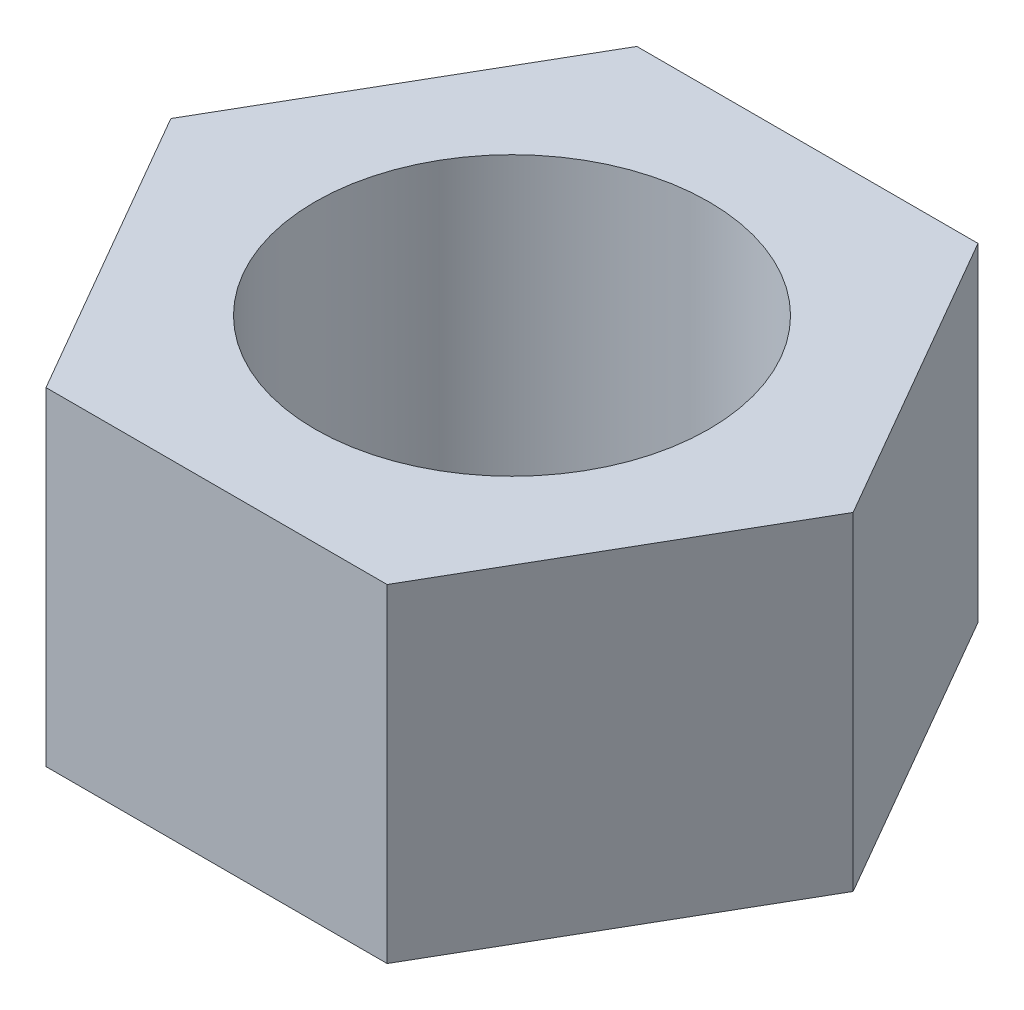
ISO-10303-21;
HEADER;
FILE_DESCRIPTION(('STEP AP214'),'2;1');
FILE_NAME('part.step','',(''),(''),'','','');
FILE_SCHEMA(('AUTOMOTIVE_DESIGN { 1 0 10303 214 1 1 1 1 }'));
ENDSEC;
DATA;
#1=APPLICATION_CONTEXT('core data for automotive mechanical design processes');
#2=APPLICATION_PROTOCOL_DEFINITION('international standard','automotive_design',2000,#1);
#3=PRODUCT_CONTEXT('',#1,'mechanical');
#4=PRODUCT('Part','Part','',(#3));
#5=PRODUCT_RELATED_PRODUCT_CATEGORY('part','',(#4));
#6=PRODUCT_DEFINITION_FORMATION('','',#4);
#7=PRODUCT_DEFINITION_CONTEXT('part definition',#1,'design');
#8=PRODUCT_DEFINITION('design','',#6,#7);
#9=PRODUCT_DEFINITION_SHAPE('','',#8);
#10=(LENGTH_UNIT() NAMED_UNIT(*) SI_UNIT(.MILLI.,.METRE.));
#11=(NAMED_UNIT(*) PLANE_ANGLE_UNIT() SI_UNIT($,.RADIAN.));
#12=(NAMED_UNIT(*) SI_UNIT($,.STERADIAN.) SOLID_ANGLE_UNIT());
#13=UNCERTAINTY_MEASURE_WITH_UNIT(LENGTH_MEASURE(1.E-05),#10,'distance_accuracy_value','');
#14=(GEOMETRIC_REPRESENTATION_CONTEXT(3) GLOBAL_UNCERTAINTY_ASSIGNED_CONTEXT((#13)) GLOBAL_UNIT_ASSIGNED_CONTEXT((#10,
#11,#12)) REPRESENTATION_CONTEXT('',''));
#15=CARTESIAN_POINT('',(0.,0.,0.));
#16=DIRECTION('',(0.,0.,1.));
#17=DIRECTION('',(1.,0.,0.));
#18=AXIS2_PLACEMENT_3D('',#15,#16,#17);
#19=CARTESIAN_POINT('',(-1.29903810567666,2.5,2.25));
#20=DIRECTION('',(0.,0.,-1.));
#21=DIRECTION('',(-1.,0.,0.));
#22=AXIS2_PLACEMENT_3D('',#19,#20,#21);
#23=PLANE('',#22);
#24=DIRECTION('',(1.,0.,0.));
#25=VECTOR('',#24,1.);
#26=CARTESIAN_POINT('',(-1.29903810567666,0.,2.25));
#27=LINE('',#26,#25);
#28=CARTESIAN_POINT('',(-1.29903810567666,0.,2.25));
#29=VERTEX_POINT('',#28);
#30=CARTESIAN_POINT('',(1.29903810567666,0.,2.25));
#31=VERTEX_POINT('',#30);
#32=EDGE_CURVE('E117',#29,#31,#27,.T.);
#33=ORIENTED_EDGE('',*,*,#32,.T.);
#34=DIRECTION('',(0.,-1.,0.));
#35=VECTOR('',#34,1.);
#36=CARTESIAN_POINT('',(1.29903810567666,2.5,2.25));
#37=LINE('',#36,#35);
#38=CARTESIAN_POINT('',(1.29903810567666,2.5,2.25));
#39=VERTEX_POINT('',#38);
#40=EDGE_CURVE('E11',#39,#31,#37,.T.);
#41=ORIENTED_EDGE('',*,*,#40,.F.);
#42=DIRECTION('',(1.,0.,0.));
#43=VECTOR('',#42,1.);
#44=CARTESIAN_POINT('',(-1.29903810567666,2.5,2.25));
#45=LINE('',#44,#43);
#46=CARTESIAN_POINT('',(-1.29903810567666,2.5,2.25));
#47=VERTEX_POINT('',#46);
#48=EDGE_CURVE('E128',#47,#39,#45,.T.);
#49=ORIENTED_EDGE('',*,*,#48,.F.);
#50=DIRECTION('',(0.,-1.,0.));
#51=VECTOR('',#50,1.);
#52=CARTESIAN_POINT('',(-1.29903810567666,2.5,2.25));
#53=LINE('',#52,#51);
#54=EDGE_CURVE('E113',#47,#29,#53,.T.);
#55=ORIENTED_EDGE('',*,*,#54,.T.);
#56=EDGE_LOOP('',(#33,#41,#49,#55));
#57=FACE_BOUND('',#56,.T.);
#58=ADVANCED_FACE('F33',(#57),#23,.F.);
#59=CARTESIAN_POINT('',(1.29903810567666,2.5,2.25));
#60=DIRECTION('',(-0.866025403784439,0.,-0.5));
#61=DIRECTION('',(-0.5,0.,0.866025403784439));
#62=AXIS2_PLACEMENT_3D('',#59,#60,#61);
#63=PLANE('',#62);
#64=DIRECTION('',(0.5,0.,-0.866025403784439));
#65=VECTOR('',#64,1.);
#66=CARTESIAN_POINT('',(1.29903810567666,0.,2.25));
#67=LINE('',#66,#65);
#68=CARTESIAN_POINT('',(2.59807621135332,0.,0.));
#69=VERTEX_POINT('',#68);
#70=EDGE_CURVE('E120',#31,#69,#67,.T.);
#71=ORIENTED_EDGE('',*,*,#70,.T.);
#72=DIRECTION('',(0.,-1.,0.));
#73=VECTOR('',#72,1.);
#74=CARTESIAN_POINT('',(2.59807621135332,2.5,0.));
#75=LINE('',#74,#73);
#76=CARTESIAN_POINT('',(2.59807621135332,2.5,0.));
#77=VERTEX_POINT('',#76);
#78=EDGE_CURVE('E41',#77,#69,#75,.T.);
#79=ORIENTED_EDGE('',*,*,#78,.F.);
#80=DIRECTION('',(0.5,0.,-0.866025403784439));
#81=VECTOR('',#80,1.);
#82=CARTESIAN_POINT('',(1.29903810567666,2.5,2.25));
#83=LINE('',#82,#81);
#84=EDGE_CURVE('E86',#39,#77,#83,.T.);
#85=ORIENTED_EDGE('',*,*,#84,.F.);
#86=ORIENTED_EDGE('',*,*,#40,.T.);
#87=EDGE_LOOP('',(#71,#79,#85,#86));
#88=FACE_BOUND('',#87,.T.);
#89=ADVANCED_FACE('F153',(#88),#63,.F.);
#90=CARTESIAN_POINT('',(2.59807621135332,2.5,0.));
#91=DIRECTION('',(-0.866025403784439,0.,0.5));
#92=DIRECTION('',(0.5,0.,0.866025403784439));
#93=AXIS2_PLACEMENT_3D('',#90,#91,#92);
#94=PLANE('',#93);
#95=DIRECTION('',(-0.5,0.,-0.866025403784439));
#96=VECTOR('',#95,1.);
#97=CARTESIAN_POINT('',(2.59807621135332,0.,0.));
#98=LINE('',#97,#96);
#99=CARTESIAN_POINT('',(1.29903810567666,0.,-2.25));
#100=VERTEX_POINT('',#99);
#101=EDGE_CURVE('E123',#69,#100,#98,.T.);
#102=ORIENTED_EDGE('',*,*,#101,.T.);
#103=DIRECTION('',(0.,-1.,0.));
#104=VECTOR('',#103,1.);
#105=CARTESIAN_POINT('',(1.29903810567666,2.5,-2.25));
#106=LINE('',#105,#104);
#107=CARTESIAN_POINT('',(1.29903810567666,2.5,-2.25));
#108=VERTEX_POINT('',#107);
#109=EDGE_CURVE('E108',#108,#100,#106,.T.);
#110=ORIENTED_EDGE('',*,*,#109,.F.);
#111=DIRECTION('',(-0.5,0.,-0.866025403784439));
#112=VECTOR('',#111,1.);
#113=CARTESIAN_POINT('',(2.59807621135332,2.5,0.));
#114=LINE('',#113,#112);
#115=EDGE_CURVE('E99',#77,#108,#114,.T.);
#116=ORIENTED_EDGE('',*,*,#115,.F.);
#117=ORIENTED_EDGE('',*,*,#78,.T.);
#118=EDGE_LOOP('',(#102,#110,#116,#117));
#119=FACE_BOUND('',#118,.T.);
#120=ADVANCED_FACE('F134',(#119),#94,.F.);
#121=CARTESIAN_POINT('',(1.29903810567666,2.5,-2.25));
#122=DIRECTION('',(0.,0.,1.));
#123=DIRECTION('',(1.,0.,0.));
#124=AXIS2_PLACEMENT_3D('',#121,#122,#123);
#125=PLANE('',#124);
#126=DIRECTION('',(-1.,0.,0.));
#127=VECTOR('',#126,1.);
#128=CARTESIAN_POINT('',(1.29903810567666,0.,-2.25));
#129=LINE('',#128,#127);
#130=CARTESIAN_POINT('',(-1.29903810567666,0.,-2.25));
#131=VERTEX_POINT('',#130);
#132=EDGE_CURVE('E107',#100,#131,#129,.T.);
#133=ORIENTED_EDGE('',*,*,#132,.T.);
#134=DIRECTION('',(0.,-1.,0.));
#135=VECTOR('',#134,1.);
#136=CARTESIAN_POINT('',(-1.29903810567666,2.5,-2.25));
#137=LINE('',#136,#135);
#138=CARTESIAN_POINT('',(-1.29903810567666,2.5,-2.25));
#139=VERTEX_POINT('',#138);
#140=EDGE_CURVE('E104',#139,#131,#137,.T.);
#141=ORIENTED_EDGE('',*,*,#140,.F.);
#142=DIRECTION('',(-1.,0.,0.));
#143=VECTOR('',#142,1.);
#144=CARTESIAN_POINT('',(1.29903810567666,2.5,-2.25));
#145=LINE('',#144,#143);
#146=EDGE_CURVE('E93',#108,#139,#145,.T.);
#147=ORIENTED_EDGE('',*,*,#146,.F.);
#148=ORIENTED_EDGE('',*,*,#109,.T.);
#149=EDGE_LOOP('',(#133,#141,#147,#148));
#150=FACE_BOUND('',#149,.T.);
#151=ADVANCED_FACE('F105',(#150),#125,.F.);
#152=CARTESIAN_POINT('',(-1.29903810567666,2.5,-2.25));
#153=DIRECTION('',(0.866025403784438,0.,0.5));
#154=DIRECTION('',(0.5,0.,-0.866025403784439));
#155=AXIS2_PLACEMENT_3D('',#152,#153,#154);
#156=PLANE('',#155);
#157=DIRECTION('',(-0.5,0.,0.866025403784438));
#158=VECTOR('',#157,1.);
#159=CARTESIAN_POINT('',(-1.29903810567666,0.,-2.25));
#160=LINE('',#159,#158);
#161=CARTESIAN_POINT('',(-2.59807621135332,0.,0.));
#162=VERTEX_POINT('',#161);
#163=EDGE_CURVE('E72',#131,#162,#160,.T.);
#164=ORIENTED_EDGE('',*,*,#163,.T.);
#165=DIRECTION('',(0.,-1.,0.));
#166=VECTOR('',#165,1.);
#167=CARTESIAN_POINT('',(-2.59807621135332,2.5,0.));
#168=LINE('',#167,#166);
#169=CARTESIAN_POINT('',(-2.59807621135332,2.5,0.));
#170=VERTEX_POINT('',#169);
#171=EDGE_CURVE('E109',#170,#162,#168,.T.);
#172=ORIENTED_EDGE('',*,*,#171,.F.);
#173=DIRECTION('',(-0.5,0.,0.866025403784438));
#174=VECTOR('',#173,1.);
#175=CARTESIAN_POINT('',(-1.29903810567666,2.5,-2.25));
#176=LINE('',#175,#174);
#177=EDGE_CURVE('E97',#139,#170,#176,.T.);
#178=ORIENTED_EDGE('',*,*,#177,.F.);
#179=ORIENTED_EDGE('',*,*,#140,.T.);
#180=EDGE_LOOP('',(#164,#172,#178,#179));
#181=FACE_BOUND('',#180,.T.);
#182=ADVANCED_FACE('F111',(#181),#156,.F.);
#183=CARTESIAN_POINT('',(-2.59807621135332,2.5,0.));
#184=DIRECTION('',(0.866025403784439,0.,-0.5));
#185=DIRECTION('',(-0.5,0.,-0.866025403784439));
#186=AXIS2_PLACEMENT_3D('',#183,#184,#185);
#187=PLANE('',#186);
#188=DIRECTION('',(0.5,0.,0.866025403784439));
#189=VECTOR('',#188,1.);
#190=CARTESIAN_POINT('',(-2.59807621135332,0.,0.));
#191=LINE('',#190,#189);
#192=EDGE_CURVE('E78',#162,#29,#191,.T.);
#193=ORIENTED_EDGE('',*,*,#192,.T.);
#194=ORIENTED_EDGE('',*,*,#54,.F.);
#195=DIRECTION('',(0.5,0.,0.866025403784439));
#196=VECTOR('',#195,1.);
#197=CARTESIAN_POINT('',(-2.59807621135332,2.5,0.));
#198=LINE('',#197,#196);
#199=EDGE_CURVE('E49',#170,#47,#198,.T.);
#200=ORIENTED_EDGE('',*,*,#199,.F.);
#201=ORIENTED_EDGE('',*,*,#171,.T.);
#202=EDGE_LOOP('',(#193,#194,#200,#201));
#203=FACE_BOUND('',#202,.T.);
#204=ADVANCED_FACE('F141',(#203),#187,.F.);
#205=CARTESIAN_POINT('',(0.,2.5,0.));
#206=DIRECTION('',(0.,1.,0.));
#207=DIRECTION('',(0.,0.,1.));
#208=AXIS2_PLACEMENT_3D('',#205,#206,#207);
#209=PLANE('',#208);
#210=CARTESIAN_POINT('',(0.,2.5,0.));
#211=DIRECTION('',(0.,1.,0.));
#212=DIRECTION('',(0.,0.,1.));
#213=AXIS2_PLACEMENT_3D('',#210,#211,#212);
#214=CIRCLE('',#213,1.5);
#215=CARTESIAN_POINT('',(0.,2.5,1.5));
#216=VERTEX_POINT('',#215);
#217=EDGE_CURVE('E208',#216,#216,#214,.T.);
#218=ORIENTED_EDGE('',*,*,#217,.F.);
#219=EDGE_LOOP('',(#218));
#220=FACE_BOUND('',#219,.T.);
#221=ORIENTED_EDGE('',*,*,#48,.T.);
#222=ORIENTED_EDGE('',*,*,#84,.T.);
#223=ORIENTED_EDGE('',*,*,#115,.T.);
#224=ORIENTED_EDGE('',*,*,#146,.T.);
#225=ORIENTED_EDGE('',*,*,#177,.T.);
#226=ORIENTED_EDGE('',*,*,#199,.T.);
#227=EDGE_LOOP('',(#221,#222,#223,#224,#225,#226));
#228=FACE_BOUND('',#227,.T.);
#229=ADVANCED_FACE('F95',(#220,#228),#209,.T.);
#230=CARTESIAN_POINT('',(0.,0.,0.));
#231=DIRECTION('',(0.,1.,0.));
#232=DIRECTION('',(0.,0.,1.));
#233=AXIS2_PLACEMENT_3D('',#230,#231,#232);
#234=PLANE('',#233);
#235=CARTESIAN_POINT('',(0.,0.,0.));
#236=DIRECTION('',(0.,1.,0.));
#237=DIRECTION('',(0.,0.,1.));
#238=AXIS2_PLACEMENT_3D('',#235,#236,#237);
#239=CIRCLE('',#238,1.5);
#240=CARTESIAN_POINT('',(0.,0.,1.5));
#241=VERTEX_POINT('',#240);
#242=EDGE_CURVE('E121',#241,#241,#239,.T.);
#243=ORIENTED_EDGE('',*,*,#242,.T.);
#244=EDGE_LOOP('',(#243));
#245=FACE_BOUND('',#244,.T.);
#246=ORIENTED_EDGE('',*,*,#32,.F.);
#247=ORIENTED_EDGE('',*,*,#192,.F.);
#248=ORIENTED_EDGE('',*,*,#163,.F.);
#249=ORIENTED_EDGE('',*,*,#132,.F.);
#250=ORIENTED_EDGE('',*,*,#101,.F.);
#251=ORIENTED_EDGE('',*,*,#70,.F.);
#252=EDGE_LOOP('',(#246,#247,#248,#249,#250,#251));
#253=FACE_BOUND('',#252,.T.);
#254=ADVANCED_FACE('F137',(#245,#253),#234,.F.);
#255=CARTESIAN_POINT('',(0.,0.,0.));
#256=DIRECTION('',(0.,1.,0.));
#257=DIRECTION('',(0.,0.,1.));
#258=AXIS2_PLACEMENT_3D('',#255,#256,#257);
#259=CYLINDRICAL_SURFACE('',#258,1.5);
#260=ORIENTED_EDGE('',*,*,#242,.F.);
#261=EDGE_LOOP('',(#260));
#262=FACE_BOUND('',#261,.T.);
#263=ORIENTED_EDGE('',*,*,#217,.T.);
#264=EDGE_LOOP('',(#263));
#265=FACE_BOUND('',#264,.T.);
#266=ADVANCED_FACE('F190',(#262,#265),#259,.F.);
#267=CLOSED_SHELL('',(#58,#89,#120,#151,#182,#204,#229,#254,#266));
#268=MANIFOLD_SOLID_BREP('B2',#267);
#269=ADVANCED_BREP_SHAPE_REPRESENTATION('',(#18,#268),#14);
#270=SHAPE_DEFINITION_REPRESENTATION(#9,#269);
ENDSEC;
END-ISO-10303-21;
